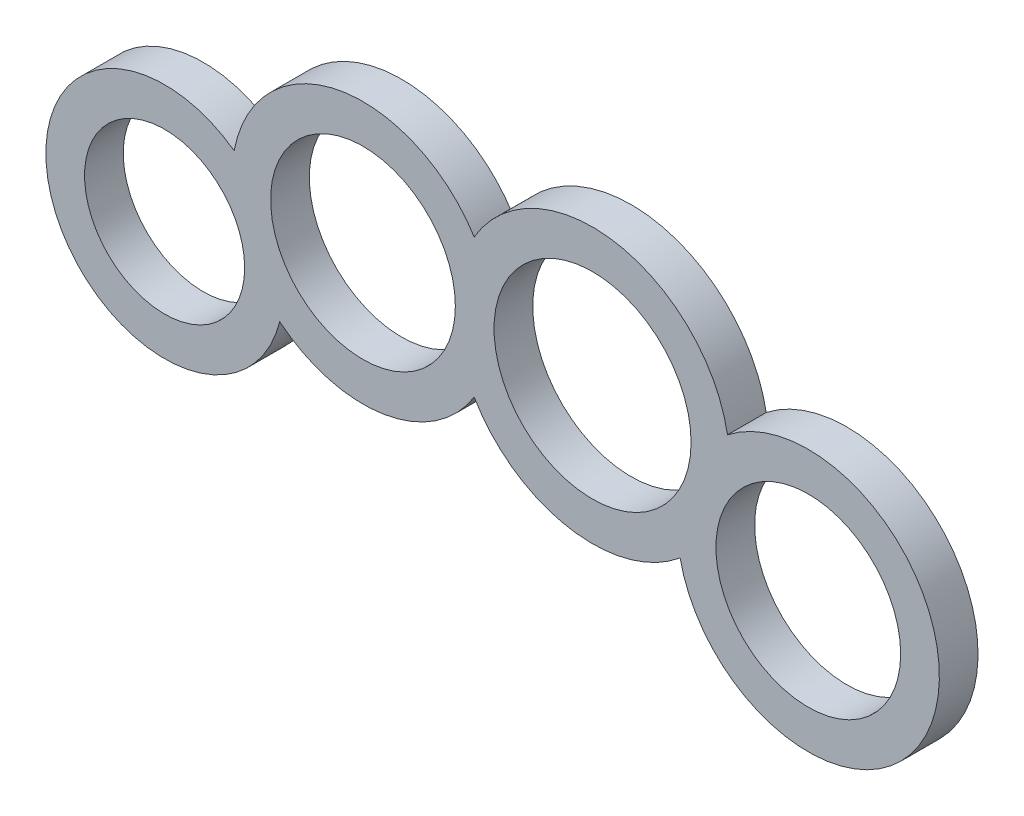
ISO-10303-21;
HEADER;
FILE_DESCRIPTION(('STEP AP214'),'2;1');
FILE_NAME('part.step','',(''),(''),'','','');
FILE_SCHEMA(('AUTOMOTIVE_DESIGN { 1 0 10303 214 1 1 1 1 }'));
ENDSEC;
DATA;
#1=APPLICATION_CONTEXT('core data for automotive mechanical design processes');
#2=APPLICATION_PROTOCOL_DEFINITION('international standard','automotive_design',2000,#1);
#3=PRODUCT_CONTEXT('',#1,'mechanical');
#4=PRODUCT('Part','Part','',(#3));
#5=PRODUCT_RELATED_PRODUCT_CATEGORY('part','',(#4));
#6=PRODUCT_DEFINITION_FORMATION('','',#4);
#7=PRODUCT_DEFINITION_CONTEXT('part definition',#1,'design');
#8=PRODUCT_DEFINITION('design','',#6,#7);
#9=PRODUCT_DEFINITION_SHAPE('','',#8);
#10=(LENGTH_UNIT() NAMED_UNIT(*) SI_UNIT(.MILLI.,.METRE.));
#11=(NAMED_UNIT(*) PLANE_ANGLE_UNIT() SI_UNIT($,.RADIAN.));
#12=(NAMED_UNIT(*) SI_UNIT($,.STERADIAN.) SOLID_ANGLE_UNIT());
#13=UNCERTAINTY_MEASURE_WITH_UNIT(LENGTH_MEASURE(1.E-05),#10,'distance_accuracy_value','');
#14=(GEOMETRIC_REPRESENTATION_CONTEXT(3) GLOBAL_UNCERTAINTY_ASSIGNED_CONTEXT((#13)) GLOBAL_UNIT_ASSIGNED_CONTEXT((#10,
#11,#12)) REPRESENTATION_CONTEXT('',''));
#15=CARTESIAN_POINT('',(0.,0.,0.));
#16=DIRECTION('',(0.,0.,1.));
#17=DIRECTION('',(1.,0.,0.));
#18=AXIS2_PLACEMENT_3D('',#15,#16,#17);
#19=CARTESIAN_POINT('',(29.66901618,0.,5.));
#20=DIRECTION('',(0.,0.,-1.));
#21=DIRECTION('',(-1.,0.,0.));
#22=AXIS2_PLACEMENT_3D('',#19,#20,#21);
#23=CYLINDRICAL_SURFACE('',#22,17.7323954473516);
#24=CARTESIAN_POINT('',(29.66901618,0.,0.));
#25=DIRECTION('',(0.,0.,1.));
#26=DIRECTION('',(1.,0.,0.));
#27=AXIS2_PLACEMENT_3D('',#24,#25,#26);
#28=CIRCLE('',#27,17.7323954473516);
#29=CARTESIAN_POINT('',(14.3695663757564,-8.96463518436131,0.));
#30=VERTEX_POINT('',#29);
#31=CARTESIAN_POINT('',(40.9797104519566,-13.6567215460953,0.));
#32=VERTEX_POINT('',#31);
#33=EDGE_CURVE('E120',#30,#32,#28,.T.);
#34=ORIENTED_EDGE('',*,*,#33,.T.);
#35=DIRECTION('',(0.,0.,-1.));
#36=VECTOR('',#35,1.);
#37=CARTESIAN_POINT('',(40.9797104519566,-13.6567215460953,5.));
#38=LINE('',#37,#36);
#39=CARTESIAN_POINT('',(40.9797104519566,-13.6567215460953,5.));
#40=VERTEX_POINT('',#39);
#41=EDGE_CURVE('E11',#40,#32,#38,.T.);
#42=ORIENTED_EDGE('',*,*,#41,.F.);
#43=CARTESIAN_POINT('',(29.66901618,0.,5.));
#44=DIRECTION('',(0.,0.,1.));
#45=DIRECTION('',(1.,0.,0.));
#46=AXIS2_PLACEMENT_3D('',#43,#44,#45);
#47=CIRCLE('',#46,17.7323954473516);
#48=CARTESIAN_POINT('',(14.3695663757564,-8.96463518436131,5.));
#49=VERTEX_POINT('',#48);
#50=EDGE_CURVE('E131',#49,#40,#47,.T.);
#51=ORIENTED_EDGE('',*,*,#50,.F.);
#52=DIRECTION('',(0.,0.,-1.));
#53=VECTOR('',#52,1.);
#54=CARTESIAN_POINT('',(14.3695663757564,-8.96463518436131,5.));
#55=LINE('',#54,#53);
#56=EDGE_CURVE('E116',#49,#30,#55,.T.);
#57=ORIENTED_EDGE('',*,*,#56,.T.);
#58=EDGE_LOOP('',(#34,#42,#51,#57));
#59=FACE_BOUND('',#58,.T.);
#60=ADVANCED_FACE('F36',(#59),#23,.T.);
#61=CARTESIAN_POINT('',(57.5487717496132,-10.1474011659564,5.));
#62=DIRECTION('',(0.,0.,-1.));
#63=DIRECTION('',(-1.,0.,0.));
#64=AXIS2_PLACEMENT_3D('',#61,#62,#63);
#65=CYLINDRICAL_SURFACE('',#64,16.9366207318922);
#66=CARTESIAN_POINT('',(57.5487717496132,-10.1474011659564,0.));
#67=DIRECTION('',(0.,0.,1.));
#68=DIRECTION('',(1.,0.,0.));
#69=AXIS2_PLACEMENT_3D('',#66,#67,#68);
#70=CIRCLE('',#69,16.9366207318922);
#71=CARTESIAN_POINT('',(47.1118820736193,3.19128151664355,0.));
#72=VERTEX_POINT('',#71);
#73=EDGE_CURVE('E123',#32,#72,#70,.T.);
#74=ORIENTED_EDGE('',*,*,#73,.T.);
#75=DIRECTION('',(0.,0.,-1.));
#76=VECTOR('',#75,1.);
#77=CARTESIAN_POINT('',(47.1118820736193,3.19128151664355,5.));
#78=LINE('',#77,#76);
#79=CARTESIAN_POINT('',(47.1118820736193,3.19128151664355,5.));
#80=VERTEX_POINT('',#79);
#81=EDGE_CURVE('E44',#80,#72,#78,.T.);
#82=ORIENTED_EDGE('',*,*,#81,.F.);
#83=CARTESIAN_POINT('',(57.5487717496132,-10.1474011659564,5.));
#84=DIRECTION('',(0.,0.,1.));
#85=DIRECTION('',(1.,0.,0.));
#86=AXIS2_PLACEMENT_3D('',#83,#84,#85);
#87=CIRCLE('',#86,16.9366207318922);
#88=EDGE_CURVE('E89',#40,#80,#87,.T.);
#89=ORIENTED_EDGE('',*,*,#88,.F.);
#90=ORIENTED_EDGE('',*,*,#41,.T.);
#91=EDGE_LOOP('',(#74,#82,#89,#90));
#92=FACE_BOUND('',#91,.T.);
#93=ADVANCED_FACE('F156',(#92),#65,.T.);
#94=CARTESIAN_POINT('',(29.66901618,0.,5.));
#95=DIRECTION('',(0.,0.,-1.));
#96=DIRECTION('',(-1.,0.,0.));
#97=AXIS2_PLACEMENT_3D('',#94,#95,#96);
#98=CYLINDRICAL_SURFACE('',#97,17.7323954473516);
#99=CARTESIAN_POINT('',(29.66901618,0.,0.));
#100=DIRECTION('',(0.,0.,1.));
#101=DIRECTION('',(1.,0.,0.));
#102=AXIS2_PLACEMENT_3D('',#99,#100,#101);
#103=CIRCLE('',#102,17.7323954473516);
#104=CARTESIAN_POINT('',(14.3695663757564,8.9646351843613,0.));
#105=VERTEX_POINT('',#104);
#106=EDGE_CURVE('E126',#72,#105,#103,.T.);
#107=ORIENTED_EDGE('',*,*,#106,.T.);
#108=DIRECTION('',(0.,0.,-1.));
#109=VECTOR('',#108,1.);
#110=CARTESIAN_POINT('',(14.3695663757564,8.9646351843613,5.));
#111=LINE('',#110,#109);
#112=CARTESIAN_POINT('',(14.3695663757564,8.9646351843613,5.));
#113=VERTEX_POINT('',#112);
#114=EDGE_CURVE('E111',#113,#105,#111,.T.);
#115=ORIENTED_EDGE('',*,*,#114,.F.);
#116=CARTESIAN_POINT('',(29.66901618,0.,5.));
#117=DIRECTION('',(0.,0.,1.));
#118=DIRECTION('',(1.,0.,0.));
#119=AXIS2_PLACEMENT_3D('',#116,#117,#118);
#120=CIRCLE('',#119,17.7323954473516);
#121=EDGE_CURVE('E102',#80,#113,#120,.T.);
#122=ORIENTED_EDGE('',*,*,#121,.F.);
#123=ORIENTED_EDGE('',*,*,#81,.T.);
#124=EDGE_LOOP('',(#107,#115,#122,#123));
#125=FACE_BOUND('',#124,.T.);
#126=ADVANCED_FACE('F137',(#125),#98,.T.);
#127=CARTESIAN_POINT('',(0.,0.,5.));
#128=DIRECTION('',(0.,0.,-1.));
#129=DIRECTION('',(-1.,0.,0.));
#130=AXIS2_PLACEMENT_3D('',#127,#128,#129);
#131=CYLINDRICAL_SURFACE('',#130,16.9366207318921);
#132=CARTESIAN_POINT('',(0.,0.,0.));
#133=DIRECTION('',(0.,0.,1.));
#134=DIRECTION('',(1.,0.,0.));
#135=AXIS2_PLACEMENT_3D('',#132,#133,#134);
#136=CIRCLE('',#135,16.9366207318921);
#137=CARTESIAN_POINT('',(-16.6491930339686,3.1070071022789,0.));
#138=VERTEX_POINT('',#137);
#139=EDGE_CURVE('E110',#105,#138,#136,.T.);
#140=ORIENTED_EDGE('',*,*,#139,.T.);
#141=DIRECTION('',(0.,0.,-1.));
#142=VECTOR('',#141,1.);
#143=CARTESIAN_POINT('',(-16.6491930339686,3.1070071022789,5.));
#144=LINE('',#143,#142);
#145=CARTESIAN_POINT('',(-16.6491930339686,3.1070071022789,5.));
#146=VERTEX_POINT('',#145);
#147=EDGE_CURVE('E107',#146,#138,#144,.T.);
#148=ORIENTED_EDGE('',*,*,#147,.F.);
#149=CARTESIAN_POINT('',(0.,0.,5.));
#150=DIRECTION('',(0.,0.,1.));
#151=DIRECTION('',(1.,0.,0.));
#152=AXIS2_PLACEMENT_3D('',#149,#150,#151);
#153=CIRCLE('',#152,16.9366207318921);
#154=EDGE_CURVE('E96',#113,#146,#153,.T.);
#155=ORIENTED_EDGE('',*,*,#154,.F.);
#156=ORIENTED_EDGE('',*,*,#114,.T.);
#157=EDGE_LOOP('',(#140,#148,#155,#156));
#158=FACE_BOUND('',#157,.T.);
#159=ADVANCED_FACE('F108',(#158),#131,.T.);
#160=CARTESIAN_POINT('',(-25.6364046831448,-9.3308882182672,5.));
#161=DIRECTION('',(0.,0.,-1.));
#162=DIRECTION('',(-1.,0.,0.));
#163=AXIS2_PLACEMENT_3D('',#160,#161,#162);
#164=CYLINDRICAL_SURFACE('',#163,15.3450713009732);
#165=CARTESIAN_POINT('',(-25.6364046831448,-9.3308882182672,0.));
#166=DIRECTION('',(0.,0.,1.));
#167=DIRECTION('',(1.,0.,0.));
#168=AXIS2_PLACEMENT_3D('',#165,#166,#167);
#169=CIRCLE('',#168,15.3450713009732);
#170=CARTESIAN_POINT('',(-10.756876137534,-13.0820005189462,0.));
#171=VERTEX_POINT('',#170);
#172=EDGE_CURVE('E75',#138,#171,#169,.T.);
#173=ORIENTED_EDGE('',*,*,#172,.T.);
#174=DIRECTION('',(0.,0.,-1.));
#175=VECTOR('',#174,1.);
#176=CARTESIAN_POINT('',(-10.756876137534,-13.0820005189462,5.));
#177=LINE('',#176,#175);
#178=CARTESIAN_POINT('',(-10.756876137534,-13.0820005189462,5.));
#179=VERTEX_POINT('',#178);
#180=EDGE_CURVE('E112',#179,#171,#177,.T.);
#181=ORIENTED_EDGE('',*,*,#180,.F.);
#182=CARTESIAN_POINT('',(-25.6364046831448,-9.3308882182672,5.));
#183=DIRECTION('',(0.,0.,1.));
#184=DIRECTION('',(1.,0.,0.));
#185=AXIS2_PLACEMENT_3D('',#182,#183,#184);
#186=CIRCLE('',#185,15.3450713009732);
#187=EDGE_CURVE('E100',#146,#179,#186,.T.);
#188=ORIENTED_EDGE('',*,*,#187,.F.);
#189=ORIENTED_EDGE('',*,*,#147,.T.);
#190=EDGE_LOOP('',(#173,#181,#188,#189));
#191=FACE_BOUND('',#190,.T.);
#192=ADVANCED_FACE('F114',(#191),#164,.T.);
#193=CARTESIAN_POINT('',(0.,0.,5.));
#194=DIRECTION('',(0.,0.,-1.));
#195=DIRECTION('',(-1.,0.,0.));
#196=AXIS2_PLACEMENT_3D('',#193,#194,#195);
#197=CYLINDRICAL_SURFACE('',#196,16.9366207318921);
#198=CARTESIAN_POINT('',(0.,0.,0.));
#199=DIRECTION('',(0.,0.,1.));
#200=DIRECTION('',(1.,0.,0.));
#201=AXIS2_PLACEMENT_3D('',#198,#199,#200);
#202=CIRCLE('',#201,16.9366207318921);
#203=EDGE_CURVE('E81',#171,#30,#202,.T.);
#204=ORIENTED_EDGE('',*,*,#203,.T.);
#205=ORIENTED_EDGE('',*,*,#56,.F.);
#206=CARTESIAN_POINT('',(0.,0.,5.));
#207=DIRECTION('',(0.,0.,1.));
#208=DIRECTION('',(1.,0.,0.));
#209=AXIS2_PLACEMENT_3D('',#206,#207,#208);
#210=CIRCLE('',#209,16.9366207318921);
#211=EDGE_CURVE('E52',#179,#49,#210,.T.);
#212=ORIENTED_EDGE('',*,*,#211,.F.);
#213=ORIENTED_EDGE('',*,*,#180,.T.);
#214=EDGE_LOOP('',(#204,#205,#212,#213));
#215=FACE_BOUND('',#214,.T.);
#216=ADVANCED_FACE('F144',(#215),#197,.T.);
#217=CARTESIAN_POINT('',(43.6088939648066,-5.07370058297818,5.));
#218=DIRECTION('',(0.,0.,1.));
#219=DIRECTION('',(1.,0.,0.));
#220=AXIS2_PLACEMENT_3D('',#217,#218,#219);
#221=PLANE('',#220);
#222=CARTESIAN_POINT('',(57.5487717496132,-10.1474011659564,5.));
#223=DIRECTION('',(0.,0.,1.));
#224=DIRECTION('',(1.,0.,0.));
#225=AXIS2_PLACEMENT_3D('',#222,#223,#224);
#226=CIRCLE('',#225,11.9366207318922);
#227=CARTESIAN_POINT('',(69.4853924815053,-10.1474011659564,5.));
#228=VERTEX_POINT('',#227);
#229=EDGE_CURVE('E242',#228,#228,#226,.T.);
#230=ORIENTED_EDGE('',*,*,#229,.F.);
#231=EDGE_LOOP('',(#230));
#232=FACE_BOUND('',#231,.T.);
#233=CARTESIAN_POINT('',(29.66901618,0.,5.));
#234=DIRECTION('',(0.,0.,1.));
#235=DIRECTION('',(1.,0.,0.));
#236=AXIS2_PLACEMENT_3D('',#233,#234,#235);
#237=CIRCLE('',#236,12.7323954473516);
#238=CARTESIAN_POINT('',(42.4014116273516,0.,5.));
#239=VERTEX_POINT('',#238);
#240=EDGE_CURVE('E244',#239,#239,#237,.T.);
#241=ORIENTED_EDGE('',*,*,#240,.F.);
#242=EDGE_LOOP('',(#241));
#243=FACE_BOUND('',#242,.T.);
#244=CARTESIAN_POINT('',(0.,0.,5.));
#245=DIRECTION('',(0.,0.,1.));
#246=DIRECTION('',(1.,0.,0.));
#247=AXIS2_PLACEMENT_3D('',#244,#245,#246);
#248=CIRCLE('',#247,11.9366207318922);
#249=CARTESIAN_POINT('',(11.9366207318922,0.,5.));
#250=VERTEX_POINT('',#249);
#251=EDGE_CURVE('E250',#250,#250,#248,.T.);
#252=ORIENTED_EDGE('',*,*,#251,.F.);
#253=EDGE_LOOP('',(#252));
#254=FACE_BOUND('',#253,.T.);
#255=CARTESIAN_POINT('',(-25.6364046831448,-9.3308882182672,5.));
#256=DIRECTION('',(0.,0.,1.));
#257=DIRECTION('',(1.,0.,0.));
#258=AXIS2_PLACEMENT_3D('',#255,#256,#257);
#259=CIRCLE('',#258,10.3450713009732);
#260=CARTESIAN_POINT('',(-15.2913333821716,-9.3308882182672,5.));
#261=VERTEX_POINT('',#260);
#262=EDGE_CURVE('E256',#261,#261,#259,.T.);
#263=ORIENTED_EDGE('',*,*,#262,.F.);
#264=EDGE_LOOP('',(#263));
#265=FACE_BOUND('',#264,.T.);
#266=ORIENTED_EDGE('',*,*,#50,.T.);
#267=ORIENTED_EDGE('',*,*,#88,.T.);
#268=ORIENTED_EDGE('',*,*,#121,.T.);
#269=ORIENTED_EDGE('',*,*,#154,.T.);
#270=ORIENTED_EDGE('',*,*,#187,.T.);
#271=ORIENTED_EDGE('',*,*,#211,.T.);
#272=EDGE_LOOP('',(#266,#267,#268,#269,#270,#271));
#273=FACE_BOUND('',#272,.T.);
#274=ADVANCED_FACE('F98',(#232,#243,#254,#265,#273),#221,.T.);
#275=CARTESIAN_POINT('',(43.6088939648066,-5.07370058297818,0.));
#276=DIRECTION('',(0.,0.,1.));
#277=DIRECTION('',(1.,0.,0.));
#278=AXIS2_PLACEMENT_3D('',#275,#276,#277);
#279=PLANE('',#278);
#280=CARTESIAN_POINT('',(57.5487717496132,-10.1474011659564,0.));
#281=DIRECTION('',(0.,0.,1.));
#282=DIRECTION('',(1.,0.,0.));
#283=AXIS2_PLACEMENT_3D('',#280,#281,#282);
#284=CIRCLE('',#283,11.9366207318922);
#285=CARTESIAN_POINT('',(69.4853924815053,-10.1474011659564,0.));
#286=VERTEX_POINT('',#285);
#287=EDGE_CURVE('E239',#286,#286,#284,.T.);
#288=ORIENTED_EDGE('',*,*,#287,.T.);
#289=EDGE_LOOP('',(#288));
#290=FACE_BOUND('',#289,.T.);
#291=CARTESIAN_POINT('',(29.66901618,0.,0.));
#292=DIRECTION('',(0.,0.,1.));
#293=DIRECTION('',(1.,0.,0.));
#294=AXIS2_PLACEMENT_3D('',#291,#292,#293);
#295=CIRCLE('',#294,12.7323954473516);
#296=CARTESIAN_POINT('',(42.4014116273516,0.,0.));
#297=VERTEX_POINT('',#296);
#298=EDGE_CURVE('E247',#297,#297,#295,.T.);
#299=ORIENTED_EDGE('',*,*,#298,.T.);
#300=EDGE_LOOP('',(#299));
#301=FACE_BOUND('',#300,.T.);
#302=CARTESIAN_POINT('',(0.,0.,0.));
#303=DIRECTION('',(0.,0.,1.));
#304=DIRECTION('',(1.,0.,0.));
#305=AXIS2_PLACEMENT_3D('',#302,#303,#304);
#306=CIRCLE('',#305,11.9366207318922);
#307=CARTESIAN_POINT('',(11.9366207318922,0.,0.));
#308=VERTEX_POINT('',#307);
#309=EDGE_CURVE('E253',#308,#308,#306,.T.);
#310=ORIENTED_EDGE('',*,*,#309,.T.);
#311=EDGE_LOOP('',(#310));
#312=FACE_BOUND('',#311,.T.);
#313=CARTESIAN_POINT('',(-25.6364046831448,-9.3308882182672,0.));
#314=DIRECTION('',(0.,0.,1.));
#315=DIRECTION('',(1.,0.,0.));
#316=AXIS2_PLACEMENT_3D('',#313,#314,#315);
#317=CIRCLE('',#316,10.3450713009732);
#318=CARTESIAN_POINT('',(-15.2913333821716,-9.3308882182672,0.));
#319=VERTEX_POINT('',#318);
#320=EDGE_CURVE('E124',#319,#319,#317,.T.);
#321=ORIENTED_EDGE('',*,*,#320,.T.);
#322=EDGE_LOOP('',(#321));
#323=FACE_BOUND('',#322,.T.);
#324=ORIENTED_EDGE('',*,*,#33,.F.);
#325=ORIENTED_EDGE('',*,*,#203,.F.);
#326=ORIENTED_EDGE('',*,*,#172,.F.);
#327=ORIENTED_EDGE('',*,*,#139,.F.);
#328=ORIENTED_EDGE('',*,*,#106,.F.);
#329=ORIENTED_EDGE('',*,*,#73,.F.);
#330=EDGE_LOOP('',(#324,#325,#326,#327,#328,#329));
#331=FACE_BOUND('',#330,.T.);
#332=ADVANCED_FACE('F140',(#290,#301,#312,#323,#331),#279,.F.);
#333=CARTESIAN_POINT('',(-25.6364046831448,-9.3308882182672,0.));
#334=DIRECTION('',(0.,0.,1.));
#335=DIRECTION('',(1.,0.,0.));
#336=AXIS2_PLACEMENT_3D('',#333,#334,#335);
#337=CYLINDRICAL_SURFACE('',#336,10.3450713009732);
#338=ORIENTED_EDGE('',*,*,#320,.F.);
#339=EDGE_LOOP('',(#338));
#340=FACE_BOUND('',#339,.T.);
#341=ORIENTED_EDGE('',*,*,#262,.T.);
#342=EDGE_LOOP('',(#341));
#343=FACE_BOUND('',#342,.T.);
#344=ADVANCED_FACE('F184',(#340,#343),#337,.F.);
#345=CARTESIAN_POINT('',(0.,0.,0.));
#346=DIRECTION('',(0.,0.,1.));
#347=DIRECTION('',(1.,0.,0.));
#348=AXIS2_PLACEMENT_3D('',#345,#346,#347);
#349=CYLINDRICAL_SURFACE('',#348,11.9366207318922);
#350=ORIENTED_EDGE('',*,*,#309,.F.);
#351=EDGE_LOOP('',(#350));
#352=FACE_BOUND('',#351,.T.);
#353=ORIENTED_EDGE('',*,*,#251,.T.);
#354=EDGE_LOOP('',(#353));
#355=FACE_BOUND('',#354,.T.);
#356=ADVANCED_FACE('F189',(#352,#355),#349,.F.);
#357=CARTESIAN_POINT('',(29.66901618,0.,0.));
#358=DIRECTION('',(0.,0.,1.));
#359=DIRECTION('',(1.,0.,0.));
#360=AXIS2_PLACEMENT_3D('',#357,#358,#359);
#361=CYLINDRICAL_SURFACE('',#360,12.7323954473516);
#362=ORIENTED_EDGE('',*,*,#298,.F.);
#363=EDGE_LOOP('',(#362));
#364=FACE_BOUND('',#363,.T.);
#365=ORIENTED_EDGE('',*,*,#240,.T.);
#366=EDGE_LOOP('',(#365));
#367=FACE_BOUND('',#366,.T.);
#368=ADVANCED_FACE('F201',(#364,#367),#361,.F.);
#369=CARTESIAN_POINT('',(57.5487717496132,-10.1474011659564,0.));
#370=DIRECTION('',(0.,0.,1.));
#371=DIRECTION('',(1.,0.,0.));
#372=AXIS2_PLACEMENT_3D('',#369,#370,#371);
#373=CYLINDRICAL_SURFACE('',#372,11.9366207318922);
#374=ORIENTED_EDGE('',*,*,#287,.F.);
#375=EDGE_LOOP('',(#374));
#376=FACE_BOUND('',#375,.T.);
#377=ORIENTED_EDGE('',*,*,#229,.T.);
#378=EDGE_LOOP('',(#377));
#379=FACE_BOUND('',#378,.T.);
#380=ADVANCED_FACE('F211',(#376,#379),#373,.F.);
#381=CLOSED_SHELL('',(#60,#93,#126,#159,#192,#216,#274,#332,#344,#356,#368,#380));
#382=MANIFOLD_SOLID_BREP('B2',#381);
#383=ADVANCED_BREP_SHAPE_REPRESENTATION('',(#18,#382),#14);
#384=SHAPE_DEFINITION_REPRESENTATION(#9,#383);
ENDSEC;
END-ISO-10303-21;
